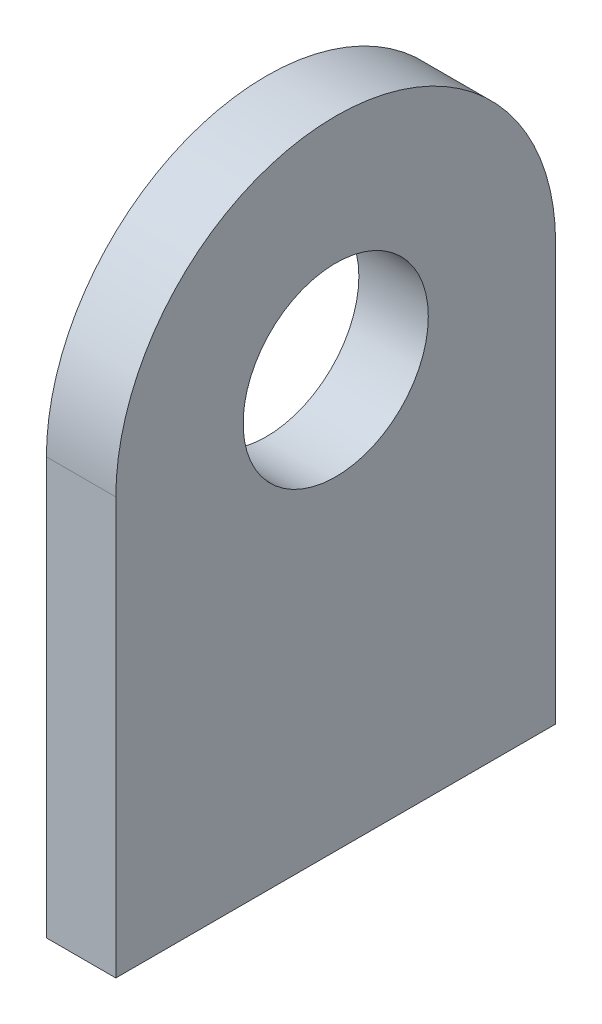
ISO-10303-21;
HEADER;
FILE_DESCRIPTION(('STEP AP214'),'2;1');
FILE_NAME('part.step','',(''),(''),'','','');
FILE_SCHEMA(('AUTOMOTIVE_DESIGN { 1 0 10303 214 1 1 1 1 }'));
ENDSEC;
DATA;
#1=APPLICATION_CONTEXT('core data for automotive mechanical design processes');
#2=APPLICATION_PROTOCOL_DEFINITION('international standard','automotive_design',2000,#1);
#3=PRODUCT_CONTEXT('',#1,'mechanical');
#4=PRODUCT('Part','Part','',(#3));
#5=PRODUCT_RELATED_PRODUCT_CATEGORY('part','',(#4));
#6=PRODUCT_DEFINITION_FORMATION('','',#4);
#7=PRODUCT_DEFINITION_CONTEXT('part definition',#1,'design');
#8=PRODUCT_DEFINITION('design','',#6,#7);
#9=PRODUCT_DEFINITION_SHAPE('','',#8);
#10=(LENGTH_UNIT() NAMED_UNIT(*) SI_UNIT(.MILLI.,.METRE.));
#11=(NAMED_UNIT(*) PLANE_ANGLE_UNIT() SI_UNIT($,.RADIAN.));
#12=(NAMED_UNIT(*) SI_UNIT($,.STERADIAN.) SOLID_ANGLE_UNIT());
#13=UNCERTAINTY_MEASURE_WITH_UNIT(LENGTH_MEASURE(1.E-05),#10,'distance_accuracy_value','');
#14=(GEOMETRIC_REPRESENTATION_CONTEXT(3) GLOBAL_UNCERTAINTY_ASSIGNED_CONTEXT((#13)) GLOBAL_UNIT_ASSIGNED_CONTEXT((#10,
#11,#12)) REPRESENTATION_CONTEXT('',''));
#15=CARTESIAN_POINT('',(0.,0.,0.));
#16=DIRECTION('',(0.,0.,1.));
#17=DIRECTION('',(1.,0.,0.));
#18=AXIS2_PLACEMENT_3D('',#15,#16,#17);
#19=CARTESIAN_POINT('',(19.5,0.,0.));
#20=DIRECTION('',(1.,0.,0.));
#21=DIRECTION('',(0.,0.,-1.));
#22=AXIS2_PLACEMENT_3D('',#19,#20,#21);
#23=PLANE('',#22);
#24=CARTESIAN_POINT('',(19.5,0.,0.));
#25=DIRECTION('',(1.,0.,0.));
#26=DIRECTION('',(0.,0.,-1.));
#27=AXIS2_PLACEMENT_3D('',#24,#25,#26);
#28=CIRCLE('',#27,9.5);
#29=CARTESIAN_POINT('',(19.5,0.,-9.5));
#30=VERTEX_POINT('',#29);
#31=CARTESIAN_POINT('',(19.5,0.,9.5));
#32=VERTEX_POINT('',#31);
#33=EDGE_CURVE('E93',#30,#32,#28,.T.);
#34=ORIENTED_EDGE('',*,*,#33,.T.);
#35=DIRECTION('',(0.,-1.,0.));
#36=VECTOR('',#35,1.);
#37=CARTESIAN_POINT('',(19.5,0.,9.5));
#38=LINE('',#37,#36);
#39=CARTESIAN_POINT('',(19.5,-18.,9.5));
#40=VERTEX_POINT('',#39);
#41=EDGE_CURVE('E88',#32,#40,#38,.T.);
#42=ORIENTED_EDGE('',*,*,#41,.T.);
#43=DIRECTION('',(0.,0.,-1.));
#44=VECTOR('',#43,1.);
#45=CARTESIAN_POINT('',(19.5,-18.,9.5));
#46=LINE('',#45,#44);
#47=CARTESIAN_POINT('',(19.5,-18.,-9.5));
#48=VERTEX_POINT('',#47);
#49=EDGE_CURVE('E91',#40,#48,#46,.T.);
#50=ORIENTED_EDGE('',*,*,#49,.T.);
#51=DIRECTION('',(0.,1.,0.));
#52=VECTOR('',#51,1.);
#53=CARTESIAN_POINT('',(19.5,-18.,-9.5));
#54=LINE('',#53,#52);
#55=EDGE_CURVE('E58',#48,#30,#54,.T.);
#56=ORIENTED_EDGE('',*,*,#55,.T.);
#57=EDGE_LOOP('',(#34,#42,#50,#56));
#58=FACE_BOUND('',#57,.T.);
#59=CARTESIAN_POINT('',(19.5,0.,0.));
#60=DIRECTION('',(1.,0.,0.));
#61=DIRECTION('',(0.,0.,-1.));
#62=AXIS2_PLACEMENT_3D('',#59,#60,#61);
#63=CIRCLE('',#62,4.);
#64=CARTESIAN_POINT('',(19.5,0.,-4.));
#65=VERTEX_POINT('',#64);
#66=EDGE_CURVE('E108',#65,#65,#63,.T.);
#67=ORIENTED_EDGE('',*,*,#66,.F.);
#68=EDGE_LOOP('',(#67));
#69=FACE_BOUND('',#68,.T.);
#70=ADVANCED_FACE('F41',(#58,#69),#23,.T.);
#71=CARTESIAN_POINT('',(16.5,0.,0.));
#72=DIRECTION('',(1.,0.,0.));
#73=DIRECTION('',(0.,0.,-1.));
#74=AXIS2_PLACEMENT_3D('',#71,#72,#73);
#75=PLANE('',#74);
#76=CARTESIAN_POINT('',(16.5,0.,0.));
#77=DIRECTION('',(1.,0.,0.));
#78=DIRECTION('',(0.,0.,-1.));
#79=AXIS2_PLACEMENT_3D('',#76,#77,#78);
#80=CIRCLE('',#79,9.5);
#81=CARTESIAN_POINT('',(16.5,0.,-9.5));
#82=VERTEX_POINT('',#81);
#83=CARTESIAN_POINT('',(16.5,0.,9.5));
#84=VERTEX_POINT('',#83);
#85=EDGE_CURVE('E105',#82,#84,#80,.T.);
#86=ORIENTED_EDGE('',*,*,#85,.F.);
#87=DIRECTION('',(0.,1.,0.));
#88=VECTOR('',#87,1.);
#89=CARTESIAN_POINT('',(16.5,-18.,-9.5));
#90=LINE('',#89,#88);
#91=CARTESIAN_POINT('',(16.5,-18.,-9.5));
#92=VERTEX_POINT('',#91);
#93=EDGE_CURVE('E81',#92,#82,#90,.T.);
#94=ORIENTED_EDGE('',*,*,#93,.F.);
#95=DIRECTION('',(0.,0.,-1.));
#96=VECTOR('',#95,1.);
#97=CARTESIAN_POINT('',(16.5,-18.,9.5));
#98=LINE('',#97,#96);
#99=CARTESIAN_POINT('',(16.5,-18.,9.5));
#100=VERTEX_POINT('',#99);
#101=EDGE_CURVE('E75',#100,#92,#98,.T.);
#102=ORIENTED_EDGE('',*,*,#101,.F.);
#103=DIRECTION('',(0.,-1.,0.));
#104=VECTOR('',#103,1.);
#105=CARTESIAN_POINT('',(16.5,0.,9.5));
#106=LINE('',#105,#104);
#107=EDGE_CURVE('E97',#84,#100,#106,.T.);
#108=ORIENTED_EDGE('',*,*,#107,.F.);
#109=EDGE_LOOP('',(#86,#94,#102,#108));
#110=FACE_BOUND('',#109,.T.);
#111=CARTESIAN_POINT('',(16.5,0.,0.));
#112=DIRECTION('',(1.,0.,0.));
#113=DIRECTION('',(0.,0.,-1.));
#114=AXIS2_PLACEMENT_3D('',#111,#112,#113);
#115=CIRCLE('',#114,4.);
#116=CARTESIAN_POINT('',(16.5,0.,-4.));
#117=VERTEX_POINT('',#116);
#118=EDGE_CURVE('E120',#117,#117,#115,.T.);
#119=ORIENTED_EDGE('',*,*,#118,.T.);
#120=EDGE_LOOP('',(#119));
#121=FACE_BOUND('',#120,.T.);
#122=ADVANCED_FACE('F116',(#110,#121),#75,.F.);
#123=CARTESIAN_POINT('',(19.5,0.,0.));
#124=DIRECTION('',(-1.,0.,0.));
#125=DIRECTION('',(0.,0.,1.));
#126=AXIS2_PLACEMENT_3D('',#123,#124,#125);
#127=CYLINDRICAL_SURFACE('',#126,9.5);
#128=ORIENTED_EDGE('',*,*,#85,.T.);
#129=DIRECTION('',(-1.,0.,0.));
#130=VECTOR('',#129,1.);
#131=CARTESIAN_POINT('',(19.5,0.,9.5));
#132=LINE('',#131,#130);
#133=EDGE_CURVE('E11',#32,#84,#132,.T.);
#134=ORIENTED_EDGE('',*,*,#133,.F.);
#135=ORIENTED_EDGE('',*,*,#33,.F.);
#136=DIRECTION('',(-1.,0.,0.));
#137=VECTOR('',#136,1.);
#138=CARTESIAN_POINT('',(19.5,0.,-9.5));
#139=LINE('',#138,#137);
#140=EDGE_CURVE('E101',#30,#82,#139,.T.);
#141=ORIENTED_EDGE('',*,*,#140,.T.);
#142=EDGE_LOOP('',(#128,#134,#135,#141));
#143=FACE_BOUND('',#142,.T.);
#144=ADVANCED_FACE('F43',(#143),#127,.T.);
#145=CARTESIAN_POINT('',(19.5,0.,9.5));
#146=DIRECTION('',(0.,0.,-1.));
#147=DIRECTION('',(0.,1.,0.));
#148=AXIS2_PLACEMENT_3D('',#145,#146,#147);
#149=PLANE('',#148);
#150=ORIENTED_EDGE('',*,*,#107,.T.);
#151=DIRECTION('',(-1.,0.,0.));
#152=VECTOR('',#151,1.);
#153=CARTESIAN_POINT('',(19.5,-18.,9.5));
#154=LINE('',#153,#152);
#155=EDGE_CURVE('E50',#40,#100,#154,.T.);
#156=ORIENTED_EDGE('',*,*,#155,.F.);
#157=ORIENTED_EDGE('',*,*,#41,.F.);
#158=ORIENTED_EDGE('',*,*,#133,.T.);
#159=EDGE_LOOP('',(#150,#156,#157,#158));
#160=FACE_BOUND('',#159,.T.);
#161=ADVANCED_FACE('F96',(#160),#149,.F.);
#162=CARTESIAN_POINT('',(19.5,-18.,9.5));
#163=DIRECTION('',(0.,1.,0.));
#164=DIRECTION('',(0.,0.,1.));
#165=AXIS2_PLACEMENT_3D('',#162,#163,#164);
#166=PLANE('',#165);
#167=ORIENTED_EDGE('',*,*,#101,.T.);
#168=DIRECTION('',(-1.,0.,0.));
#169=VECTOR('',#168,1.);
#170=CARTESIAN_POINT('',(19.5,-18.,-9.5));
#171=LINE('',#170,#169);
#172=EDGE_CURVE('E98',#48,#92,#171,.T.);
#173=ORIENTED_EDGE('',*,*,#172,.F.);
#174=ORIENTED_EDGE('',*,*,#49,.F.);
#175=ORIENTED_EDGE('',*,*,#155,.T.);
#176=EDGE_LOOP('',(#167,#173,#174,#175));
#177=FACE_BOUND('',#176,.T.);
#178=ADVANCED_FACE('F99',(#177),#166,.F.);
#179=CARTESIAN_POINT('',(19.5,-18.,-9.5));
#180=DIRECTION('',(0.,0.,1.));
#181=DIRECTION('',(0.,-1.,0.));
#182=AXIS2_PLACEMENT_3D('',#179,#180,#181);
#183=PLANE('',#182);
#184=ORIENTED_EDGE('',*,*,#93,.T.);
#185=ORIENTED_EDGE('',*,*,#140,.F.);
#186=ORIENTED_EDGE('',*,*,#55,.F.);
#187=ORIENTED_EDGE('',*,*,#172,.T.);
#188=EDGE_LOOP('',(#184,#185,#186,#187));
#189=FACE_BOUND('',#188,.T.);
#190=ADVANCED_FACE('F113',(#189),#183,.F.);
#191=CARTESIAN_POINT('',(19.5,0.,0.));
#192=DIRECTION('',(-1.,0.,0.));
#193=DIRECTION('',(0.,0.,1.));
#194=AXIS2_PLACEMENT_3D('',#191,#192,#193);
#195=CYLINDRICAL_SURFACE('',#194,4.);
#196=ORIENTED_EDGE('',*,*,#66,.T.);
#197=EDGE_LOOP('',(#196));
#198=FACE_BOUND('',#197,.T.);
#199=ORIENTED_EDGE('',*,*,#118,.F.);
#200=EDGE_LOOP('',(#199));
#201=FACE_BOUND('',#200,.T.);
#202=ADVANCED_FACE('F126',(#198,#201),#195,.F.);
#203=CLOSED_SHELL('',(#70,#122,#144,#161,#178,#190,#202));
#204=MANIFOLD_SOLID_BREP('B2',#203);
#205=ADVANCED_BREP_SHAPE_REPRESENTATION('',(#18,#204),#14);
#206=SHAPE_DEFINITION_REPRESENTATION(#9,#205);
ENDSEC;
END-ISO-10303-21;
